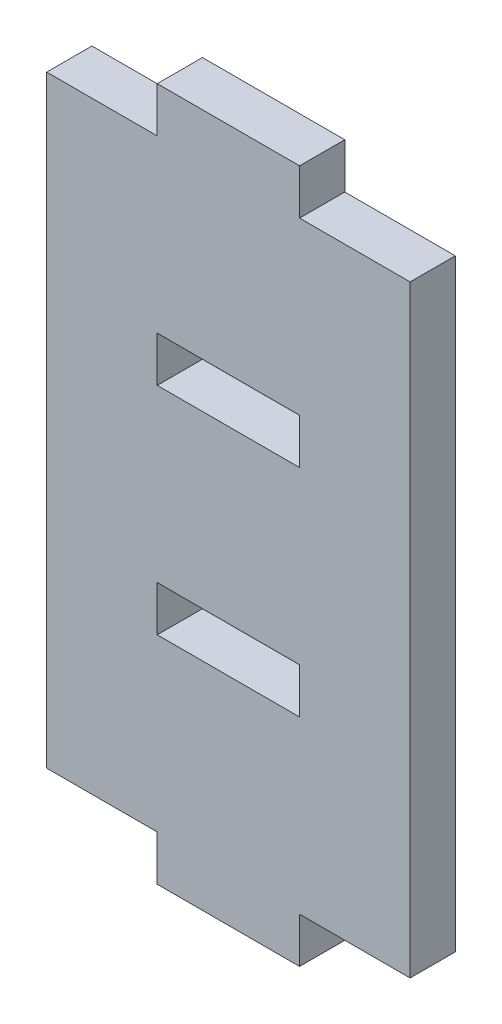
ISO-10303-21;
HEADER;
FILE_DESCRIPTION(('STEP AP214'),'2;1');
FILE_NAME('part.step','',(''),(''),'','','');
FILE_SCHEMA(('AUTOMOTIVE_DESIGN { 1 0 10303 214 1 1 1 1 }'));
ENDSEC;
DATA;
#1=APPLICATION_CONTEXT('core data for automotive mechanical design processes');
#2=APPLICATION_PROTOCOL_DEFINITION('international standard','automotive_design',2000,#1);
#3=PRODUCT_CONTEXT('',#1,'mechanical');
#4=PRODUCT('Part','Part','',(#3));
#5=PRODUCT_RELATED_PRODUCT_CATEGORY('part','',(#4));
#6=PRODUCT_DEFINITION_FORMATION('','',#4);
#7=PRODUCT_DEFINITION_CONTEXT('part definition',#1,'design');
#8=PRODUCT_DEFINITION('design','',#6,#7);
#9=PRODUCT_DEFINITION_SHAPE('','',#8);
#10=(LENGTH_UNIT() NAMED_UNIT(*) SI_UNIT(.MILLI.,.METRE.));
#11=(NAMED_UNIT(*) PLANE_ANGLE_UNIT() SI_UNIT($,.RADIAN.));
#12=(NAMED_UNIT(*) SI_UNIT($,.STERADIAN.) SOLID_ANGLE_UNIT());
#13=UNCERTAINTY_MEASURE_WITH_UNIT(LENGTH_MEASURE(1.E-05),#10,'distance_accuracy_value','');
#14=(GEOMETRIC_REPRESENTATION_CONTEXT(3) GLOBAL_UNCERTAINTY_ASSIGNED_CONTEXT((#13)) GLOBAL_UNIT_ASSIGNED_CONTEXT((#10,
#11,#12)) REPRESENTATION_CONTEXT('',''));
#15=CARTESIAN_POINT('',(0.,0.,0.));
#16=DIRECTION('',(0.,0.,1.));
#17=DIRECTION('',(1.,0.,0.));
#18=AXIS2_PLACEMENT_3D('',#15,#16,#17);
#19=CARTESIAN_POINT('',(0.,0.,1.5875));
#20=DIRECTION('',(0.,0.,1.));
#21=DIRECTION('',(1.,0.,0.));
#22=AXIS2_PLACEMENT_3D('',#19,#20,#21);
#23=PLANE('',#22);
#24=DIRECTION('',(-1.,0.,0.));
#25=VECTOR('',#24,1.);
#26=CARTESIAN_POINT('',(-10.,15.1766666666667,1.5875));
#27=LINE('',#26,#25);
#28=CARTESIAN_POINT('',(0.,15.1766666666667,1.5875));
#29=VERTEX_POINT('',#28);
#30=CARTESIAN_POINT('',(-10.,15.1766666666667,1.5875));
#31=VERTEX_POINT('',#30);
#32=EDGE_CURVE('E208',#29,#31,#27,.T.);
#33=ORIENTED_EDGE('',*,*,#32,.F.);
#34=DIRECTION('',(0.,1.,0.));
#35=VECTOR('',#34,1.);
#36=CARTESIAN_POINT('',(0.,15.1766666666667,1.5875));
#37=LINE('',#36,#35);
#38=CARTESIAN_POINT('',(0.,11.9966666666667,1.5875));
#39=VERTEX_POINT('',#38);
#40=EDGE_CURVE('E206',#39,#29,#37,.T.);
#41=ORIENTED_EDGE('',*,*,#40,.F.);
#42=DIRECTION('',(1.,0.,0.));
#43=VECTOR('',#42,1.);
#44=CARTESIAN_POINT('',(0.,11.9966666666667,1.5875));
#45=LINE('',#44,#43);
#46=CARTESIAN_POINT('',(-10.,11.9966666666667,1.5875));
#47=VERTEX_POINT('',#46);
#48=EDGE_CURVE('E214',#47,#39,#45,.T.);
#49=ORIENTED_EDGE('',*,*,#48,.F.);
#50=DIRECTION('',(0.,-1.,0.));
#51=VECTOR('',#50,1.);
#52=CARTESIAN_POINT('',(-10.,11.9966666666667,1.5875));
#53=LINE('',#52,#51);
#54=EDGE_CURVE('E211',#31,#47,#53,.T.);
#55=ORIENTED_EDGE('',*,*,#54,.F.);
#56=EDGE_LOOP('',(#33,#41,#49,#55));
#57=FACE_BOUND('',#56,.T.);
#58=DIRECTION('',(1.,0.,0.));
#59=VECTOR('',#58,1.);
#60=CARTESIAN_POINT('',(7.765,0.,1.5875));
#61=LINE('',#60,#59);
#62=CARTESIAN_POINT('',(0.,0.,1.5875));
#63=VERTEX_POINT('',#62);
#64=CARTESIAN_POINT('',(7.765,0.,1.5875));
#65=VERTEX_POINT('',#64);
#66=EDGE_CURVE('E237',#63,#65,#61,.T.);
#67=ORIENTED_EDGE('',*,*,#66,.T.);
#68=DIRECTION('',(0.,1.,0.));
#69=VECTOR('',#68,1.);
#70=CARTESIAN_POINT('',(7.76500000000001,42.35,1.5875));
#71=LINE('',#70,#69);
#72=CARTESIAN_POINT('',(7.76500000000001,42.35,1.5875));
#73=VERTEX_POINT('',#72);
#74=EDGE_CURVE('E240',#65,#73,#71,.T.);
#75=ORIENTED_EDGE('',*,*,#74,.T.);
#76=DIRECTION('',(-1.,0.,0.));
#77=VECTOR('',#76,1.);
#78=CARTESIAN_POINT('',(0.,42.35,1.5875));
#79=LINE('',#78,#77);
#80=CARTESIAN_POINT('',(0.,42.35,1.5875));
#81=VERTEX_POINT('',#80);
#82=EDGE_CURVE('E243',#73,#81,#79,.T.);
#83=ORIENTED_EDGE('',*,*,#82,.T.);
#84=DIRECTION('',(0.,1.,0.));
#85=VECTOR('',#84,1.);
#86=CARTESIAN_POINT('',(0.,45.53,1.5875));
#87=LINE('',#86,#85);
#88=CARTESIAN_POINT('',(0.,45.53,1.5875));
#89=VERTEX_POINT('',#88);
#90=EDGE_CURVE('E245',#81,#89,#87,.T.);
#91=ORIENTED_EDGE('',*,*,#90,.T.);
#92=DIRECTION('',(-1.,0.,0.));
#93=VECTOR('',#92,1.);
#94=CARTESIAN_POINT('',(-10.,45.53,1.5875));
#95=LINE('',#94,#93);
#96=CARTESIAN_POINT('',(-10.,45.53,1.5875));
#97=VERTEX_POINT('',#96);
#98=EDGE_CURVE('E247',#89,#97,#95,.T.);
#99=ORIENTED_EDGE('',*,*,#98,.T.);
#100=DIRECTION('',(0.,-1.,0.));
#101=VECTOR('',#100,1.);
#102=CARTESIAN_POINT('',(-10.,42.35,1.5875));
#103=LINE('',#102,#101);
#104=CARTESIAN_POINT('',(-10.,42.35,1.5875));
#105=VERTEX_POINT('',#104);
#106=EDGE_CURVE('E249',#97,#105,#103,.T.);
#107=ORIENTED_EDGE('',*,*,#106,.T.);
#108=DIRECTION('',(-1.,0.,0.));
#109=VECTOR('',#108,1.);
#110=CARTESIAN_POINT('',(-17.765,42.35,1.5875));
#111=LINE('',#110,#109);
#112=CARTESIAN_POINT('',(-17.765,42.35,1.5875));
#113=VERTEX_POINT('',#112);
#114=EDGE_CURVE('E251',#105,#113,#111,.T.);
#115=ORIENTED_EDGE('',*,*,#114,.T.);
#116=DIRECTION('',(0.,-1.,0.));
#117=VECTOR('',#116,1.);
#118=CARTESIAN_POINT('',(-17.765,0.,1.5875));
#119=LINE('',#118,#117);
#120=CARTESIAN_POINT('',(-17.765,0.,1.5875));
#121=VERTEX_POINT('',#120);
#122=EDGE_CURVE('E253',#113,#121,#119,.T.);
#123=ORIENTED_EDGE('',*,*,#122,.T.);
#124=DIRECTION('',(1.,0.,0.));
#125=VECTOR('',#124,1.);
#126=CARTESIAN_POINT('',(-10.,0.,1.5875));
#127=LINE('',#126,#125);
#128=CARTESIAN_POINT('',(-10.,0.,1.5875));
#129=VERTEX_POINT('',#128);
#130=EDGE_CURVE('E255',#121,#129,#127,.T.);
#131=ORIENTED_EDGE('',*,*,#130,.T.);
#132=DIRECTION('',(0.,-1.,0.));
#133=VECTOR('',#132,1.);
#134=CARTESIAN_POINT('',(-10.,-3.18,1.5875));
#135=LINE('',#134,#133);
#136=CARTESIAN_POINT('',(-10.,-3.18,1.5875));
#137=VERTEX_POINT('',#136);
#138=EDGE_CURVE('E257',#129,#137,#135,.T.);
#139=ORIENTED_EDGE('',*,*,#138,.T.);
#140=DIRECTION('',(1.,0.,0.));
#141=VECTOR('',#140,1.);
#142=CARTESIAN_POINT('',(0.,-3.18,1.5875));
#143=LINE('',#142,#141);
#144=CARTESIAN_POINT('',(0.,-3.18,1.5875));
#145=VERTEX_POINT('',#144);
#146=EDGE_CURVE('E259',#137,#145,#143,.T.);
#147=ORIENTED_EDGE('',*,*,#146,.T.);
#148=DIRECTION('',(0.,1.,0.));
#149=VECTOR('',#148,1.);
#150=CARTESIAN_POINT('',(0.,0.,1.5875));
#151=LINE('',#150,#149);
#152=EDGE_CURVE('E261',#145,#63,#151,.T.);
#153=ORIENTED_EDGE('',*,*,#152,.T.);
#154=EDGE_LOOP('',(#67,#75,#83,#91,#99,#107,#115,#123,#131,#139,#147,#153));
#155=FACE_BOUND('',#154,.T.);
#156=DIRECTION('',(-1.,0.,0.));
#157=VECTOR('',#156,1.);
#158=CARTESIAN_POINT('',(-10.,30.3533333333333,1.5875));
#159=LINE('',#158,#157);
#160=CARTESIAN_POINT('',(0.,30.3533333333333,1.5875));
#161=VERTEX_POINT('',#160);
#162=CARTESIAN_POINT('',(-10.,30.3533333333333,1.5875));
#163=VERTEX_POINT('',#162);
#164=EDGE_CURVE('E178',#161,#163,#159,.T.);
#165=ORIENTED_EDGE('',*,*,#164,.F.);
#166=DIRECTION('',(0.,1.,0.));
#167=VECTOR('',#166,1.);
#168=CARTESIAN_POINT('',(0.,30.3533333333333,1.5875));
#169=LINE('',#168,#167);
#170=CARTESIAN_POINT('',(0.,27.1733333333333,1.5875));
#171=VERTEX_POINT('',#170);
#172=EDGE_CURVE('E170',#171,#161,#169,.T.);
#173=ORIENTED_EDGE('',*,*,#172,.F.);
#174=DIRECTION('',(1.,0.,0.));
#175=VECTOR('',#174,1.);
#176=CARTESIAN_POINT('',(0.,27.1733333333333,1.5875));
#177=LINE('',#176,#175);
#178=CARTESIAN_POINT('',(-10.,27.1733333333333,1.5875));
#179=VERTEX_POINT('',#178);
#180=EDGE_CURVE('E192',#179,#171,#177,.T.);
#181=ORIENTED_EDGE('',*,*,#180,.F.);
#182=DIRECTION('',(0.,-1.,0.));
#183=VECTOR('',#182,1.);
#184=CARTESIAN_POINT('',(-10.,27.1733333333333,1.5875));
#185=LINE('',#184,#183);
#186=EDGE_CURVE('E190',#163,#179,#185,.T.);
#187=ORIENTED_EDGE('',*,*,#186,.F.);
#188=EDGE_LOOP('',(#165,#173,#181,#187));
#189=FACE_BOUND('',#188,.T.);
#190=ADVANCED_FACE('F33',(#57,#155,#189),#23,.T.);
#191=CARTESIAN_POINT('',(0.,0.,-1.5875));
#192=DIRECTION('',(0.,0.,1.));
#193=DIRECTION('',(1.,0.,0.));
#194=AXIS2_PLACEMENT_3D('',#191,#192,#193);
#195=PLANE('',#194);
#196=DIRECTION('',(0.,1.,0.));
#197=VECTOR('',#196,1.);
#198=CARTESIAN_POINT('',(0.,15.1766666666667,-1.5875));
#199=LINE('',#198,#197);
#200=CARTESIAN_POINT('',(0.,11.9966666666667,-1.5875));
#201=VERTEX_POINT('',#200);
#202=CARTESIAN_POINT('',(0.,15.1766666666667,-1.5875));
#203=VERTEX_POINT('',#202);
#204=EDGE_CURVE('E186',#201,#203,#199,.T.);
#205=ORIENTED_EDGE('',*,*,#204,.T.);
#206=DIRECTION('',(-1.,0.,0.));
#207=VECTOR('',#206,1.);
#208=CARTESIAN_POINT('',(-10.,15.1766666666667,-1.5875));
#209=LINE('',#208,#207);
#210=CARTESIAN_POINT('',(-10.,15.1766666666667,-1.5875));
#211=VERTEX_POINT('',#210);
#212=EDGE_CURVE('E219',#203,#211,#209,.T.);
#213=ORIENTED_EDGE('',*,*,#212,.T.);
#214=DIRECTION('',(0.,-1.,0.));
#215=VECTOR('',#214,1.);
#216=CARTESIAN_POINT('',(-10.,11.9966666666667,-1.5875));
#217=LINE('',#216,#215);
#218=CARTESIAN_POINT('',(-10.,11.9966666666667,-1.5875));
#219=VERTEX_POINT('',#218);
#220=EDGE_CURVE('E222',#211,#219,#217,.T.);
#221=ORIENTED_EDGE('',*,*,#220,.T.);
#222=DIRECTION('',(1.,0.,0.));
#223=VECTOR('',#222,1.);
#224=CARTESIAN_POINT('',(0.,11.9966666666667,-1.5875));
#225=LINE('',#224,#223);
#226=EDGE_CURVE('E209',#219,#201,#225,.T.);
#227=ORIENTED_EDGE('',*,*,#226,.T.);
#228=EDGE_LOOP('',(#205,#213,#221,#227));
#229=FACE_BOUND('',#228,.T.);
#230=DIRECTION('',(1.,0.,0.));
#231=VECTOR('',#230,1.);
#232=CARTESIAN_POINT('',(7.765,0.,-1.5875));
#233=LINE('',#232,#231);
#234=CARTESIAN_POINT('',(0.,0.,-1.5875));
#235=VERTEX_POINT('',#234);
#236=CARTESIAN_POINT('',(7.765,0.,-1.5875));
#237=VERTEX_POINT('',#236);
#238=EDGE_CURVE('E236',#235,#237,#233,.T.);
#239=ORIENTED_EDGE('',*,*,#238,.F.);
#240=DIRECTION('',(0.,1.,0.));
#241=VECTOR('',#240,1.);
#242=CARTESIAN_POINT('',(0.,0.,-1.5875));
#243=LINE('',#242,#241);
#244=CARTESIAN_POINT('',(0.,-3.18,-1.5875));
#245=VERTEX_POINT('',#244);
#246=EDGE_CURVE('E241',#245,#235,#243,.T.);
#247=ORIENTED_EDGE('',*,*,#246,.F.);
#248=DIRECTION('',(1.,0.,0.));
#249=VECTOR('',#248,1.);
#250=CARTESIAN_POINT('',(0.,-3.18,-1.5875));
#251=LINE('',#250,#249);
#252=CARTESIAN_POINT('',(-10.,-3.18,-1.5875));
#253=VERTEX_POINT('',#252);
#254=EDGE_CURVE('E284',#253,#245,#251,.T.);
#255=ORIENTED_EDGE('',*,*,#254,.F.);
#256=DIRECTION('',(0.,-1.,0.));
#257=VECTOR('',#256,1.);
#258=CARTESIAN_POINT('',(-10.,-3.18,-1.5875));
#259=LINE('',#258,#257);
#260=CARTESIAN_POINT('',(-10.,0.,-1.5875));
#261=VERTEX_POINT('',#260);
#262=EDGE_CURVE('E282',#261,#253,#259,.T.);
#263=ORIENTED_EDGE('',*,*,#262,.F.);
#264=DIRECTION('',(1.,0.,0.));
#265=VECTOR('',#264,1.);
#266=CARTESIAN_POINT('',(-10.,0.,-1.5875));
#267=LINE('',#266,#265);
#268=CARTESIAN_POINT('',(-17.765,0.,-1.5875));
#269=VERTEX_POINT('',#268);
#270=EDGE_CURVE('E280',#269,#261,#267,.T.);
#271=ORIENTED_EDGE('',*,*,#270,.F.);
#272=DIRECTION('',(0.,-1.,0.));
#273=VECTOR('',#272,1.);
#274=CARTESIAN_POINT('',(-17.765,0.,-1.5875));
#275=LINE('',#274,#273);
#276=CARTESIAN_POINT('',(-17.765,42.35,-1.5875));
#277=VERTEX_POINT('',#276);
#278=EDGE_CURVE('E278',#277,#269,#275,.T.);
#279=ORIENTED_EDGE('',*,*,#278,.F.);
#280=DIRECTION('',(-1.,0.,0.));
#281=VECTOR('',#280,1.);
#282=CARTESIAN_POINT('',(-17.765,42.35,-1.5875));
#283=LINE('',#282,#281);
#284=CARTESIAN_POINT('',(-10.,42.35,-1.5875));
#285=VERTEX_POINT('',#284);
#286=EDGE_CURVE('E276',#285,#277,#283,.T.);
#287=ORIENTED_EDGE('',*,*,#286,.F.);
#288=DIRECTION('',(0.,-1.,0.));
#289=VECTOR('',#288,1.);
#290=CARTESIAN_POINT('',(-10.,42.35,-1.5875));
#291=LINE('',#290,#289);
#292=CARTESIAN_POINT('',(-10.,45.53,-1.5875));
#293=VERTEX_POINT('',#292);
#294=EDGE_CURVE('E274',#293,#285,#291,.T.);
#295=ORIENTED_EDGE('',*,*,#294,.F.);
#296=DIRECTION('',(-1.,0.,0.));
#297=VECTOR('',#296,1.);
#298=CARTESIAN_POINT('',(-10.,45.53,-1.5875));
#299=LINE('',#298,#297);
#300=CARTESIAN_POINT('',(0.,45.53,-1.5875));
#301=VERTEX_POINT('',#300);
#302=EDGE_CURVE('E272',#301,#293,#299,.T.);
#303=ORIENTED_EDGE('',*,*,#302,.F.);
#304=DIRECTION('',(0.,1.,0.));
#305=VECTOR('',#304,1.);
#306=CARTESIAN_POINT('',(0.,45.53,-1.5875));
#307=LINE('',#306,#305);
#308=CARTESIAN_POINT('',(0.,42.35,-1.5875));
#309=VERTEX_POINT('',#308);
#310=EDGE_CURVE('E270',#309,#301,#307,.T.);
#311=ORIENTED_EDGE('',*,*,#310,.F.);
#312=DIRECTION('',(-1.,0.,0.));
#313=VECTOR('',#312,1.);
#314=CARTESIAN_POINT('',(0.,42.35,-1.5875));
#315=LINE('',#314,#313);
#316=CARTESIAN_POINT('',(7.76500000000001,42.35,-1.5875));
#317=VERTEX_POINT('',#316);
#318=EDGE_CURVE('E268',#317,#309,#315,.T.);
#319=ORIENTED_EDGE('',*,*,#318,.F.);
#320=DIRECTION('',(0.,1.,0.));
#321=VECTOR('',#320,1.);
#322=CARTESIAN_POINT('',(7.76500000000001,42.35,-1.5875));
#323=LINE('',#322,#321);
#324=EDGE_CURVE('E266',#237,#317,#323,.T.);
#325=ORIENTED_EDGE('',*,*,#324,.F.);
#326=EDGE_LOOP('',(#239,#247,#255,#263,#271,#279,#287,#295,#303,#311,#319,#325));
#327=FACE_BOUND('',#326,.T.);
#328=DIRECTION('',(0.,1.,0.));
#329=VECTOR('',#328,1.);
#330=CARTESIAN_POINT('',(0.,30.3533333333333,-1.5875));
#331=LINE('',#330,#329);
#332=CARTESIAN_POINT('',(0.,27.1733333333333,-1.5875));
#333=VERTEX_POINT('',#332);
#334=CARTESIAN_POINT('',(0.,30.3533333333333,-1.5875));
#335=VERTEX_POINT('',#334);
#336=EDGE_CURVE('E56',#333,#335,#331,.T.);
#337=ORIENTED_EDGE('',*,*,#336,.T.);
#338=DIRECTION('',(-1.,0.,0.));
#339=VECTOR('',#338,1.);
#340=CARTESIAN_POINT('',(-10.,30.3533333333333,-1.5875));
#341=LINE('',#340,#339);
#342=CARTESIAN_POINT('',(-10.,30.3533333333333,-1.5875));
#343=VERTEX_POINT('',#342);
#344=EDGE_CURVE('E185',#335,#343,#341,.T.);
#345=ORIENTED_EDGE('',*,*,#344,.T.);
#346=DIRECTION('',(0.,-1.,0.));
#347=VECTOR('',#346,1.);
#348=CARTESIAN_POINT('',(-10.,27.1733333333333,-1.5875));
#349=LINE('',#348,#347);
#350=CARTESIAN_POINT('',(-10.,27.1733333333333,-1.5875));
#351=VERTEX_POINT('',#350);
#352=EDGE_CURVE('E198',#343,#351,#349,.T.);
#353=ORIENTED_EDGE('',*,*,#352,.T.);
#354=DIRECTION('',(1.,0.,0.));
#355=VECTOR('',#354,1.);
#356=CARTESIAN_POINT('',(0.,27.1733333333333,-1.5875));
#357=LINE('',#356,#355);
#358=EDGE_CURVE('E179',#351,#333,#357,.T.);
#359=ORIENTED_EDGE('',*,*,#358,.T.);
#360=EDGE_LOOP('',(#337,#345,#353,#359));
#361=FACE_BOUND('',#360,.T.);
#362=ADVANCED_FACE('F326',(#229,#327,#361),#195,.F.);
#363=CARTESIAN_POINT('',(7.765,0.,1.5875));
#364=DIRECTION('',(0.,1.,0.));
#365=DIRECTION('',(-1.,0.,0.));
#366=AXIS2_PLACEMENT_3D('',#363,#364,#365);
#367=PLANE('',#366);
#368=ORIENTED_EDGE('',*,*,#238,.T.);
#369=DIRECTION('',(0.,0.,-1.));
#370=VECTOR('',#369,1.);
#371=CARTESIAN_POINT('',(7.765,0.,1.5875));
#372=LINE('',#371,#370);
#373=EDGE_CURVE('E11',#65,#237,#372,.T.);
#374=ORIENTED_EDGE('',*,*,#373,.F.);
#375=ORIENTED_EDGE('',*,*,#66,.F.);
#376=DIRECTION('',(0.,0.,-1.));
#377=VECTOR('',#376,1.);
#378=CARTESIAN_POINT('',(0.,0.,1.5875));
#379=LINE('',#378,#377);
#380=EDGE_CURVE('E263',#63,#235,#379,.T.);
#381=ORIENTED_EDGE('',*,*,#380,.T.);
#382=EDGE_LOOP('',(#368,#374,#375,#381));
#383=FACE_BOUND('',#382,.T.);
#384=ADVANCED_FACE('F35',(#383),#367,.F.);
#385=CARTESIAN_POINT('',(7.76500000000001,42.35,1.5875));
#386=DIRECTION('',(-1.,0.,0.));
#387=DIRECTION('',(0.,-1.,0.));
#388=AXIS2_PLACEMENT_3D('',#385,#386,#387);
#389=PLANE('',#388);
#390=ORIENTED_EDGE('',*,*,#324,.T.);
#391=DIRECTION('',(0.,0.,-1.));
#392=VECTOR('',#391,1.);
#393=CARTESIAN_POINT('',(7.76500000000001,42.35,1.5875));
#394=LINE('',#393,#392);
#395=EDGE_CURVE('E41',#73,#317,#394,.T.);
#396=ORIENTED_EDGE('',*,*,#395,.F.);
#397=ORIENTED_EDGE('',*,*,#74,.F.);
#398=ORIENTED_EDGE('',*,*,#373,.T.);
#399=EDGE_LOOP('',(#390,#396,#397,#398));
#400=FACE_BOUND('',#399,.T.);
#401=ADVANCED_FACE('F343',(#400),#389,.F.);
#402=CARTESIAN_POINT('',(0.,42.35,1.5875));
#403=DIRECTION('',(0.,-1.,0.));
#404=DIRECTION('',(0.,0.,-1.));
#405=AXIS2_PLACEMENT_3D('',#402,#403,#404);
#406=PLANE('',#405);
#407=ORIENTED_EDGE('',*,*,#318,.T.);
#408=DIRECTION('',(0.,0.,-1.));
#409=VECTOR('',#408,1.);
#410=CARTESIAN_POINT('',(0.,42.35,1.5875));
#411=LINE('',#410,#409);
#412=EDGE_CURVE('E313',#81,#309,#411,.T.);
#413=ORIENTED_EDGE('',*,*,#412,.F.);
#414=ORIENTED_EDGE('',*,*,#82,.F.);
#415=ORIENTED_EDGE('',*,*,#395,.T.);
#416=EDGE_LOOP('',(#407,#413,#414,#415));
#417=FACE_BOUND('',#416,.T.);
#418=ADVANCED_FACE('F320',(#417),#406,.F.);
#419=CARTESIAN_POINT('',(0.,45.53,1.5875));
#420=DIRECTION('',(-1.,0.,0.));
#421=DIRECTION('',(0.,-1.,0.));
#422=AXIS2_PLACEMENT_3D('',#419,#420,#421);
#423=PLANE('',#422);
#424=ORIENTED_EDGE('',*,*,#310,.T.);
#425=DIRECTION('',(0.,0.,-1.));
#426=VECTOR('',#425,1.);
#427=CARTESIAN_POINT('',(0.,45.53,1.5875));
#428=LINE('',#427,#426);
#429=EDGE_CURVE('E310',#89,#301,#428,.T.);
#430=ORIENTED_EDGE('',*,*,#429,.F.);
#431=ORIENTED_EDGE('',*,*,#90,.F.);
#432=ORIENTED_EDGE('',*,*,#412,.T.);
#433=EDGE_LOOP('',(#424,#430,#431,#432));
#434=FACE_BOUND('',#433,.T.);
#435=ADVANCED_FACE('F332',(#434),#423,.F.);
#436=CARTESIAN_POINT('',(-10.,45.53,1.5875));
#437=DIRECTION('',(0.,-1.,0.));
#438=DIRECTION('',(0.,0.,-1.));
#439=AXIS2_PLACEMENT_3D('',#436,#437,#438);
#440=PLANE('',#439);
#441=ORIENTED_EDGE('',*,*,#302,.T.);
#442=DIRECTION('',(0.,0.,-1.));
#443=VECTOR('',#442,1.);
#444=CARTESIAN_POINT('',(-10.,45.53,1.5875));
#445=LINE('',#444,#443);
#446=EDGE_CURVE('E307',#97,#293,#445,.T.);
#447=ORIENTED_EDGE('',*,*,#446,.F.);
#448=ORIENTED_EDGE('',*,*,#98,.F.);
#449=ORIENTED_EDGE('',*,*,#429,.T.);
#450=EDGE_LOOP('',(#441,#447,#448,#449));
#451=FACE_BOUND('',#450,.T.);
#452=ADVANCED_FACE('F336',(#451),#440,.F.);
#453=CARTESIAN_POINT('',(-10.,42.35,1.5875));
#454=DIRECTION('',(1.,0.,0.));
#455=DIRECTION('',(0.,0.,-1.));
#456=AXIS2_PLACEMENT_3D('',#453,#454,#455);
#457=PLANE('',#456);
#458=ORIENTED_EDGE('',*,*,#294,.T.);
#459=DIRECTION('',(0.,0.,-1.));
#460=VECTOR('',#459,1.);
#461=CARTESIAN_POINT('',(-10.,42.35,1.5875));
#462=LINE('',#461,#460);
#463=EDGE_CURVE('E304',#105,#285,#462,.T.);
#464=ORIENTED_EDGE('',*,*,#463,.F.);
#465=ORIENTED_EDGE('',*,*,#106,.F.);
#466=ORIENTED_EDGE('',*,*,#446,.T.);
#467=EDGE_LOOP('',(#458,#464,#465,#466));
#468=FACE_BOUND('',#467,.T.);
#469=ADVANCED_FACE('F376',(#468),#457,.F.);
#470=CARTESIAN_POINT('',(-17.765,42.35,1.5875));
#471=DIRECTION('',(0.,-1.,0.));
#472=DIRECTION('',(0.,0.,-1.));
#473=AXIS2_PLACEMENT_3D('',#470,#471,#472);
#474=PLANE('',#473);
#475=ORIENTED_EDGE('',*,*,#286,.T.);
#476=DIRECTION('',(0.,0.,-1.));
#477=VECTOR('',#476,1.);
#478=CARTESIAN_POINT('',(-17.765,42.35,1.5875));
#479=LINE('',#478,#477);
#480=EDGE_CURVE('E301',#113,#277,#479,.T.);
#481=ORIENTED_EDGE('',*,*,#480,.F.);
#482=ORIENTED_EDGE('',*,*,#114,.F.);
#483=ORIENTED_EDGE('',*,*,#463,.T.);
#484=EDGE_LOOP('',(#475,#481,#482,#483));
#485=FACE_BOUND('',#484,.T.);
#486=ADVANCED_FACE('F374',(#485),#474,.F.);
#487=CARTESIAN_POINT('',(-17.765,0.,1.5875));
#488=DIRECTION('',(1.,0.,0.));
#489=DIRECTION('',(0.,1.,0.));
#490=AXIS2_PLACEMENT_3D('',#487,#488,#489);
#491=PLANE('',#490);
#492=ORIENTED_EDGE('',*,*,#278,.T.);
#493=DIRECTION('',(0.,0.,-1.));
#494=VECTOR('',#493,1.);
#495=CARTESIAN_POINT('',(-17.765,0.,1.5875));
#496=LINE('',#495,#494);
#497=EDGE_CURVE('E298',#121,#269,#496,.T.);
#498=ORIENTED_EDGE('',*,*,#497,.F.);
#499=ORIENTED_EDGE('',*,*,#122,.F.);
#500=ORIENTED_EDGE('',*,*,#480,.T.);
#501=EDGE_LOOP('',(#492,#498,#499,#500));
#502=FACE_BOUND('',#501,.T.);
#503=ADVANCED_FACE('F370',(#502),#491,.F.);
#504=CARTESIAN_POINT('',(-10.,0.,1.5875));
#505=DIRECTION('',(0.,1.,0.));
#506=DIRECTION('',(-1.,0.,0.));
#507=AXIS2_PLACEMENT_3D('',#504,#505,#506);
#508=PLANE('',#507);
#509=ORIENTED_EDGE('',*,*,#270,.T.);
#510=DIRECTION('',(0.,0.,-1.));
#511=VECTOR('',#510,1.);
#512=CARTESIAN_POINT('',(-10.,0.,1.5875));
#513=LINE('',#512,#511);
#514=EDGE_CURVE('E295',#129,#261,#513,.T.);
#515=ORIENTED_EDGE('',*,*,#514,.F.);
#516=ORIENTED_EDGE('',*,*,#130,.F.);
#517=ORIENTED_EDGE('',*,*,#497,.T.);
#518=EDGE_LOOP('',(#509,#515,#516,#517));
#519=FACE_BOUND('',#518,.T.);
#520=ADVANCED_FACE('F365',(#519),#508,.F.);
#521=CARTESIAN_POINT('',(-10.,-3.18,1.5875));
#522=DIRECTION('',(1.,0.,0.));
#523=DIRECTION('',(0.,0.,-1.));
#524=AXIS2_PLACEMENT_3D('',#521,#522,#523);
#525=PLANE('',#524);
#526=ORIENTED_EDGE('',*,*,#262,.T.);
#527=DIRECTION('',(0.,0.,-1.));
#528=VECTOR('',#527,1.);
#529=CARTESIAN_POINT('',(-10.,-3.18,1.5875));
#530=LINE('',#529,#528);
#531=EDGE_CURVE('E292',#137,#253,#530,.T.);
#532=ORIENTED_EDGE('',*,*,#531,.F.);
#533=ORIENTED_EDGE('',*,*,#138,.F.);
#534=ORIENTED_EDGE('',*,*,#514,.T.);
#535=EDGE_LOOP('',(#526,#532,#533,#534));
#536=FACE_BOUND('',#535,.T.);
#537=ADVANCED_FACE('F359',(#536),#525,.F.);
#538=CARTESIAN_POINT('',(0.,-3.18,1.5875));
#539=DIRECTION('',(0.,1.,0.));
#540=DIRECTION('',(-1.,0.,0.));
#541=AXIS2_PLACEMENT_3D('',#538,#539,#540);
#542=PLANE('',#541);
#543=ORIENTED_EDGE('',*,*,#254,.T.);
#544=DIRECTION('',(0.,0.,-1.));
#545=VECTOR('',#544,1.);
#546=CARTESIAN_POINT('',(0.,-3.18,1.5875));
#547=LINE('',#546,#545);
#548=EDGE_CURVE('E289',#145,#245,#547,.T.);
#549=ORIENTED_EDGE('',*,*,#548,.F.);
#550=ORIENTED_EDGE('',*,*,#146,.F.);
#551=ORIENTED_EDGE('',*,*,#531,.T.);
#552=EDGE_LOOP('',(#543,#549,#550,#551));
#553=FACE_BOUND('',#552,.T.);
#554=ADVANCED_FACE('F355',(#553),#542,.F.);
#555=CARTESIAN_POINT('',(0.,0.,1.5875));
#556=DIRECTION('',(-1.,0.,0.));
#557=DIRECTION('',(0.,-1.,0.));
#558=AXIS2_PLACEMENT_3D('',#555,#556,#557);
#559=PLANE('',#558);
#560=ORIENTED_EDGE('',*,*,#246,.T.);
#561=ORIENTED_EDGE('',*,*,#380,.F.);
#562=ORIENTED_EDGE('',*,*,#152,.F.);
#563=ORIENTED_EDGE('',*,*,#548,.T.);
#564=EDGE_LOOP('',(#560,#561,#562,#563));
#565=FACE_BOUND('',#564,.T.);
#566=ADVANCED_FACE('F350',(#565),#559,.F.);
#567=CARTESIAN_POINT('',(0.,15.1766666666667,1.5875));
#568=DIRECTION('',(-1.,0.,0.));
#569=DIRECTION('',(0.,0.,1.));
#570=AXIS2_PLACEMENT_3D('',#567,#568,#569);
#571=PLANE('',#570);
#572=ORIENTED_EDGE('',*,*,#204,.F.);
#573=DIRECTION('',(0.,0.,-1.));
#574=VECTOR('',#573,1.);
#575=CARTESIAN_POINT('',(0.,11.9966666666667,1.5875));
#576=LINE('',#575,#574);
#577=EDGE_CURVE('E216',#39,#201,#576,.T.);
#578=ORIENTED_EDGE('',*,*,#577,.F.);
#579=ORIENTED_EDGE('',*,*,#40,.T.);
#580=DIRECTION('',(0.,0.,-1.));
#581=VECTOR('',#580,1.);
#582=CARTESIAN_POINT('',(0.,15.1766666666667,1.5875));
#583=LINE('',#582,#581);
#584=EDGE_CURVE('E233',#29,#203,#583,.T.);
#585=ORIENTED_EDGE('',*,*,#584,.T.);
#586=EDGE_LOOP('',(#572,#578,#579,#585));
#587=FACE_BOUND('',#586,.T.);
#588=ADVANCED_FACE('F395',(#587),#571,.T.);
#589=CARTESIAN_POINT('',(-10.,15.1766666666667,1.5875));
#590=DIRECTION('',(0.,-1.,0.));
#591=DIRECTION('',(0.,0.,-1.));
#592=AXIS2_PLACEMENT_3D('',#589,#590,#591);
#593=PLANE('',#592);
#594=ORIENTED_EDGE('',*,*,#212,.F.);
#595=ORIENTED_EDGE('',*,*,#584,.F.);
#596=ORIENTED_EDGE('',*,*,#32,.T.);
#597=DIRECTION('',(0.,0.,-1.));
#598=VECTOR('',#597,1.);
#599=CARTESIAN_POINT('',(-10.,15.1766666666667,1.5875));
#600=LINE('',#599,#598);
#601=EDGE_CURVE('E231',#31,#211,#600,.T.);
#602=ORIENTED_EDGE('',*,*,#601,.T.);
#603=EDGE_LOOP('',(#594,#595,#596,#602));
#604=FACE_BOUND('',#603,.T.);
#605=ADVANCED_FACE('F433',(#604),#593,.T.);
#606=CARTESIAN_POINT('',(-10.,11.9966666666667,1.5875));
#607=DIRECTION('',(1.,0.,0.));
#608=DIRECTION('',(0.,0.,-1.));
#609=AXIS2_PLACEMENT_3D('',#606,#607,#608);
#610=PLANE('',#609);
#611=ORIENTED_EDGE('',*,*,#220,.F.);
#612=ORIENTED_EDGE('',*,*,#601,.F.);
#613=ORIENTED_EDGE('',*,*,#54,.T.);
#614=DIRECTION('',(0.,0.,-1.));
#615=VECTOR('',#614,1.);
#616=CARTESIAN_POINT('',(-10.,11.9966666666667,1.5875));
#617=LINE('',#616,#615);
#618=EDGE_CURVE('E229',#47,#219,#617,.T.);
#619=ORIENTED_EDGE('',*,*,#618,.T.);
#620=EDGE_LOOP('',(#611,#612,#613,#619));
#621=FACE_BOUND('',#620,.T.);
#622=ADVANCED_FACE('F440',(#621),#610,.T.);
#623=CARTESIAN_POINT('',(0.,11.9966666666667,1.5875));
#624=DIRECTION('',(0.,1.,0.));
#625=DIRECTION('',(0.,0.,1.));
#626=AXIS2_PLACEMENT_3D('',#623,#624,#625);
#627=PLANE('',#626);
#628=ORIENTED_EDGE('',*,*,#226,.F.);
#629=ORIENTED_EDGE('',*,*,#618,.F.);
#630=ORIENTED_EDGE('',*,*,#48,.T.);
#631=ORIENTED_EDGE('',*,*,#577,.T.);
#632=EDGE_LOOP('',(#628,#629,#630,#631));
#633=FACE_BOUND('',#632,.T.);
#634=ADVANCED_FACE('F447',(#633),#627,.T.);
#635=CARTESIAN_POINT('',(0.,30.3533333333333,1.5875));
#636=DIRECTION('',(-1.,0.,0.));
#637=DIRECTION('',(0.,0.,1.));
#638=AXIS2_PLACEMENT_3D('',#635,#636,#637);
#639=PLANE('',#638);
#640=ORIENTED_EDGE('',*,*,#336,.F.);
#641=DIRECTION('',(0.,0.,-1.));
#642=VECTOR('',#641,1.);
#643=CARTESIAN_POINT('',(0.,27.1733333333333,1.5875));
#644=LINE('',#643,#642);
#645=EDGE_CURVE('E174',#171,#333,#644,.T.);
#646=ORIENTED_EDGE('',*,*,#645,.F.);
#647=ORIENTED_EDGE('',*,*,#172,.T.);
#648=DIRECTION('',(0.,0.,-1.));
#649=VECTOR('',#648,1.);
#650=CARTESIAN_POINT('',(0.,30.3533333333333,1.5875));
#651=LINE('',#650,#649);
#652=EDGE_CURVE('E173',#161,#335,#651,.T.);
#653=ORIENTED_EDGE('',*,*,#652,.T.);
#654=EDGE_LOOP('',(#640,#646,#647,#653));
#655=FACE_BOUND('',#654,.T.);
#656=ADVANCED_FACE('F172',(#655),#639,.T.);
#657=CARTESIAN_POINT('',(-10.,30.3533333333333,1.5875));
#658=DIRECTION('',(0.,-1.,0.));
#659=DIRECTION('',(0.,0.,-1.));
#660=AXIS2_PLACEMENT_3D('',#657,#658,#659);
#661=PLANE('',#660);
#662=ORIENTED_EDGE('',*,*,#344,.F.);
#663=ORIENTED_EDGE('',*,*,#652,.F.);
#664=ORIENTED_EDGE('',*,*,#164,.T.);
#665=DIRECTION('',(0.,0.,-1.));
#666=VECTOR('',#665,1.);
#667=CARTESIAN_POINT('',(-10.,30.3533333333333,1.5875));
#668=LINE('',#667,#666);
#669=EDGE_CURVE('E187',#163,#343,#668,.T.);
#670=ORIENTED_EDGE('',*,*,#669,.T.);
#671=EDGE_LOOP('',(#662,#663,#664,#670));
#672=FACE_BOUND('',#671,.T.);
#673=ADVANCED_FACE('F182',(#672),#661,.T.);
#674=CARTESIAN_POINT('',(-10.,27.1733333333333,1.5875));
#675=DIRECTION('',(1.,0.,0.));
#676=DIRECTION('',(0.,0.,-1.));
#677=AXIS2_PLACEMENT_3D('',#674,#675,#676);
#678=PLANE('',#677);
#679=ORIENTED_EDGE('',*,*,#352,.F.);
#680=ORIENTED_EDGE('',*,*,#669,.F.);
#681=ORIENTED_EDGE('',*,*,#186,.T.);
#682=DIRECTION('',(0.,0.,-1.));
#683=VECTOR('',#682,1.);
#684=CARTESIAN_POINT('',(-10.,27.1733333333333,1.5875));
#685=LINE('',#684,#683);
#686=EDGE_CURVE('E48',#179,#351,#685,.T.);
#687=ORIENTED_EDGE('',*,*,#686,.T.);
#688=EDGE_LOOP('',(#679,#680,#681,#687));
#689=FACE_BOUND('',#688,.T.);
#690=ADVANCED_FACE('F468',(#689),#678,.T.);
#691=CARTESIAN_POINT('',(0.,27.1733333333333,1.5875));
#692=DIRECTION('',(0.,1.,0.));
#693=DIRECTION('',(0.,0.,1.));
#694=AXIS2_PLACEMENT_3D('',#691,#692,#693);
#695=PLANE('',#694);
#696=ORIENTED_EDGE('',*,*,#358,.F.);
#697=ORIENTED_EDGE('',*,*,#686,.F.);
#698=ORIENTED_EDGE('',*,*,#180,.T.);
#699=ORIENTED_EDGE('',*,*,#645,.T.);
#700=EDGE_LOOP('',(#696,#697,#698,#699));
#701=FACE_BOUND('',#700,.T.);
#702=ADVANCED_FACE('F475',(#701),#695,.T.);
#703=CLOSED_SHELL('',(#190,#362,#384,#401,#418,#435,#452,#469,#486,#503,#520,#537,#554,#566,
#588,#605,#622,#634,#656,#673,#690,#702));
#704=MANIFOLD_SOLID_BREP('B2',#703);
#705=ADVANCED_BREP_SHAPE_REPRESENTATION('',(#18,#704),#14);
#706=SHAPE_DEFINITION_REPRESENTATION(#9,#705);
ENDSEC;
END-ISO-10303-21;
